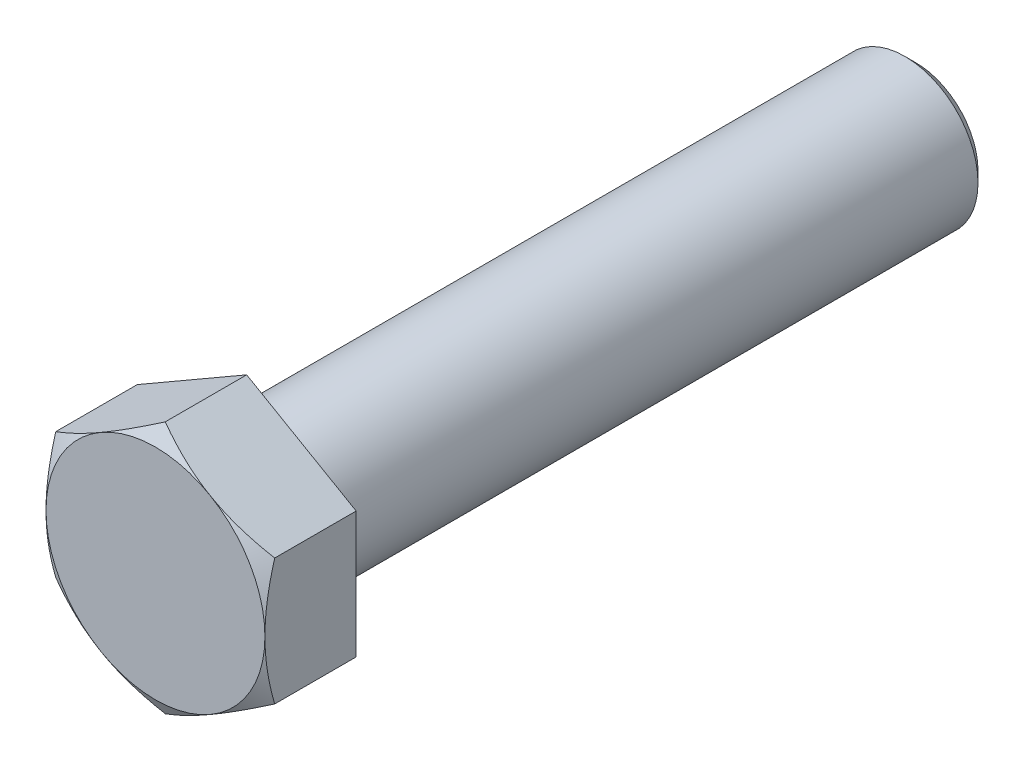
ISO-10303-21;
HEADER;
FILE_DESCRIPTION(('STEP AP214'),'2;1');
FILE_NAME('part.step','',(''),(''),'','','');
FILE_SCHEMA(('AUTOMOTIVE_DESIGN { 1 0 10303 214 1 1 1 1 }'));
ENDSEC;
DATA;
#1=APPLICATION_CONTEXT('core data for automotive mechanical design processes');
#2=APPLICATION_PROTOCOL_DEFINITION('international standard','automotive_design',2000,#1);
#3=PRODUCT_CONTEXT('',#1,'mechanical');
#4=PRODUCT('Part','Part','',(#3));
#5=PRODUCT_RELATED_PRODUCT_CATEGORY('part','',(#4));
#6=PRODUCT_DEFINITION_FORMATION('','',#4);
#7=PRODUCT_DEFINITION_CONTEXT('part definition',#1,'design');
#8=PRODUCT_DEFINITION('design','',#6,#7);
#9=PRODUCT_DEFINITION_SHAPE('','',#8);
#10=(LENGTH_UNIT() NAMED_UNIT(*) SI_UNIT(.MILLI.,.METRE.));
#11=(NAMED_UNIT(*) PLANE_ANGLE_UNIT() SI_UNIT($,.RADIAN.));
#12=(NAMED_UNIT(*) SI_UNIT($,.STERADIAN.) SOLID_ANGLE_UNIT());
#13=UNCERTAINTY_MEASURE_WITH_UNIT(LENGTH_MEASURE(1.E-05),#10,'distance_accuracy_value','');
#14=(GEOMETRIC_REPRESENTATION_CONTEXT(3) GLOBAL_UNCERTAINTY_ASSIGNED_CONTEXT((#13)) GLOBAL_UNIT_ASSIGNED_CONTEXT((#10,
#11,#12)) REPRESENTATION_CONTEXT('',''));
#15=CARTESIAN_POINT('',(0.,0.,0.));
#16=DIRECTION('',(0.,0.,1.));
#17=DIRECTION('',(1.,0.,0.));
#18=AXIS2_PLACEMENT_3D('',#15,#16,#17);
#19=CARTESIAN_POINT('',(0.,0.,7.5));
#20=DIRECTION('',(0.,0.,1.));
#21=DIRECTION('',(1.,0.,0.));
#22=AXIS2_PLACEMENT_3D('',#19,#20,#21);
#23=PLANE('',#22);
#24=CARTESIAN_POINT('',(0.,0.,7.50000000089275));
#25=DIRECTION('',(0.,0.,-1.));
#26=DIRECTION('',(-1.,0.,0.));
#27=AXIS2_PLACEMENT_3D('',#24,#25,#26);
#28=CIRCLE('',#27,9.00000000051543);
#29=CARTESIAN_POINT('',(4.49980199141646,7.79434295131304,7.50000000104154));
#30=VERTEX_POINT('',#29);
#31=CARTESIAN_POINT('',(9.00000000025772,0.,7.50000000104154));
#32=VERTEX_POINT('',#31);
#33=EDGE_CURVE('E330',#30,#32,#28,.T.);
#34=ORIENTED_EDGE('',*,*,#33,.F.);
#35=CARTESIAN_POINT('',(0.,0.,7.50000000089275));
#36=DIRECTION('',(0.,0.,-1.));
#37=DIRECTION('',(-1.,0.,0.));
#38=AXIS2_PLACEMENT_3D('',#35,#36,#37);
#39=CIRCLE('',#38,9.00000000051543);
#40=CARTESIAN_POINT('',(-4.49980199141648,7.79434295131303,7.50000000104154));
#41=VERTEX_POINT('',#40);
#42=EDGE_CURVE('E93',#41,#30,#39,.T.);
#43=ORIENTED_EDGE('',*,*,#42,.F.);
#44=CARTESIAN_POINT('',(0.,0.,7.50000000089275));
#45=DIRECTION('',(0.,0.,-1.));
#46=DIRECTION('',(-1.,0.,0.));
#47=AXIS2_PLACEMENT_3D('',#44,#45,#46);
#48=CIRCLE('',#47,9.00000000051543);
#49=CARTESIAN_POINT('',(-9.00000000025772,0.,7.50000000104155));
#50=VERTEX_POINT('',#49);
#51=EDGE_CURVE('E89',#50,#41,#48,.T.);
#52=ORIENTED_EDGE('',*,*,#51,.F.);
#53=CARTESIAN_POINT('',(0.,0.,7.50000000089275));
#54=DIRECTION('',(0.,0.,-1.));
#55=DIRECTION('',(-1.,0.,0.));
#56=AXIS2_PLACEMENT_3D('',#53,#54,#55);
#57=CIRCLE('',#56,9.00000000051543);
#58=CARTESIAN_POINT('',(-4.49980199141646,-7.79434295131305,7.50000000104154));
#59=VERTEX_POINT('',#58);
#60=EDGE_CURVE('E87',#59,#50,#57,.T.);
#61=ORIENTED_EDGE('',*,*,#60,.F.);
#62=CARTESIAN_POINT('',(0.,0.,7.50000000089275));
#63=DIRECTION('',(0.,0.,-1.));
#64=DIRECTION('',(-1.,0.,0.));
#65=AXIS2_PLACEMENT_3D('',#62,#63,#64);
#66=CIRCLE('',#65,9.00000000051543);
#67=CARTESIAN_POINT('',(4.49980199141647,-7.79434295131304,7.50000000104154));
#68=VERTEX_POINT('',#67);
#69=EDGE_CURVE('E20',#68,#59,#66,.T.);
#70=ORIENTED_EDGE('',*,*,#69,.F.);
#71=CARTESIAN_POINT('',(0.,0.,7.50000000089275));
#72=DIRECTION('',(0.,0.,-1.));
#73=DIRECTION('',(-1.,0.,0.));
#74=AXIS2_PLACEMENT_3D('',#71,#72,#73);
#75=CIRCLE('',#74,9.00000000051543);
#76=EDGE_CURVE('E104',#32,#68,#75,.T.);
#77=ORIENTED_EDGE('',*,*,#76,.F.);
#78=EDGE_LOOP('',(#34,#43,#52,#61,#70,#77));
#79=FACE_BOUND('',#78,.T.);
#80=ADVANCED_FACE('F17',(#79),#23,.T.);
#81=CARTESIAN_POINT('',(0.,0.,6.69141786445974));
#82=DIRECTION('',(0.,0.,-1.));
#83=DIRECTION('',(-1.,0.,0.));
#84=AXIS2_PLACEMENT_3D('',#81,#82,#83);
#85=CONICAL_SURFACE('',#84,10.4005053390398,1.04719755);
#86=ORIENTED_EDGE('',*,*,#69,.T.);
#87=CARTESIAN_POINT('',(-3.04325983601087E-10,-10.3921524249865,6.69624042187021));
#88=CARTESIAN_POINT('',(-0.366282650871695,-10.1806914446505,6.81835813302795));
#89=CARTESIAN_POINT('',(-0.735498461515287,-9.96753710299313,6.93023881785971));
#90=CARTESIAN_POINT('',(-1.47718445953881,-9.5393496146992,7.12753786716259));
#91=CARTESIAN_POINT('',(-1.84962878033096,-9.32433140126753,7.21308707136055));
#92=CARTESIAN_POINT('',(-2.41180986483081,-8.99977504297948,7.31812669429929));
#93=CARTESIAN_POINT('',(-2.59991363178527,-8.89117965393486,7.34927195340002));
#94=CARTESIAN_POINT('',(-2.97702159999228,-8.67346904036239,7.4031849885857));
#95=CARTESIAN_POINT('',(-3.16602577742088,-8.5643538295885,7.42595298509127));
#96=CARTESIAN_POINT('',(-3.54563361027975,-8.34520000316293,7.46271150557113));
#97=CARTESIAN_POINT('',(-3.73624053221588,-8.23515950170385,7.47665739610894));
#98=CARTESIAN_POINT('',(-4.1178291891883,-8.01486211303708,7.49532094447683));
#99=CARTESIAN_POINT('',(-4.30881099094728,-7.90460518730928,7.50003677511759));
#100=CARTESIAN_POINT('',(-4.49980199126901,-7.79434295110059,7.50000000119034));
#101=B_SPLINE_CURVE_WITH_KNOTS('',3,(#87,#88,#89,#90,#91,#92,#93,#94,#95,#96,#97,#98,#99,#100),
.UNSPECIFIED.,.F.,.F.,(4,2,2,2,2,2,4),(0.,1.32118640259763,2.63569777605002,3.29381576738512,
3.95191644123143,4.61332054383155,5.27485556522859),.UNSPECIFIED.);
#102=CARTESIAN_POINT('',(-1.18928590936815E-10,-10.3921524248736,6.69624042171544));
#103=VERTEX_POINT('',#102);
#104=EDGE_CURVE('E99',#103,#59,#101,.T.);
#105=ORIENTED_EDGE('',*,*,#104,.F.);
#106=CARTESIAN_POINT('',(4.49980199122319,-7.79434295097825,7.50000000111594));
#107=CARTESIAN_POINT('',(4.30881099093911,-7.90460518726072,7.50003677509123));
#108=CARTESIAN_POINT('',(4.11782918919385,-8.01486211301964,7.49532094447014));
#109=CARTESIAN_POINT('',(3.73624053222854,-8.23515950171078,7.47665739611652));
#110=CARTESIAN_POINT('',(3.5456336102858,-8.34520000316313,7.46271150557336));
#111=CARTESIAN_POINT('',(3.16602577742061,-8.56435382958498,7.4259529850896));
#112=CARTESIAN_POINT('',(2.97702159999227,-8.67346904036184,7.40318498858548));
#113=CARTESIAN_POINT('',(2.59991363178349,-8.89117965393645,7.34927195339998));
#114=CARTESIAN_POINT('',(2.41180986482701,-8.99977504298023,7.31812669429795));
#115=CARTESIAN_POINT('',(1.84962878032432,-9.32433140127427,7.21308707136057));
#116=CARTESIAN_POINT('',(1.47718445953471,-9.53934961472117,7.12753786717053));
#117=CARTESIAN_POINT('',(0.735498461491745,-9.96753710298703,6.93023881784436));
#118=CARTESIAN_POINT('',(0.366282650826081,-10.1806914446008,6.81835813298107));
#119=CARTESIAN_POINT('',(2.09095072674275E-10,-10.3921524248215,6.69624042174549));
#120=B_SPLINE_CURVE_WITH_KNOTS('',3,(#106,#107,#108,#109,#110,#111,#112,#113,#114,#115,#116,
#117,#118,#119),.UNSPECIFIED.,.F.,.F.,(4,2,2,2,2,2,4),(0.,0.66153502140683,1.32293912401436,
1.98103979786425,2.63915778920398,3.95366916266618,5.27485556527991),.UNSPECIFIED.);
#121=EDGE_CURVE('E102',#68,#103,#120,.T.);
#122=ORIENTED_EDGE('',*,*,#121,.F.);
#123=EDGE_LOOP('',(#86,#105,#122));
#124=FACE_BOUND('',#123,.T.);
#125=ADVANCED_FACE('F97',(#124),#85,.T.);
#126=CARTESIAN_POINT('',(0.,0.,6.69128507002485));
#127=DIRECTION('',(0.,0.,-1.));
#128=DIRECTION('',(-1.,0.,0.));
#129=AXIS2_PLACEMENT_3D('',#126,#127,#128);
#130=CONICAL_SURFACE('',#129,10.4007353457474,1.04719755);
#131=ORIENTED_EDGE('',*,*,#76,.T.);
#132=CARTESIAN_POINT('',(8.9999999998861,-5.19630485017032,6.69610841944983));
#133=CARTESIAN_POINT('',(8.63368614233858,-5.4077838465214,6.81824455309161));
#134=CARTESIAN_POINT('',(8.2644386302865,-5.62095648980817,6.93014280452131));
#135=CARTESIAN_POINT('',(7.52268861379889,-6.04918093693101,7.12747361831722));
#136=CARTESIAN_POINT('',(7.15021198431769,-6.26421780273128,7.21303705310768));
#137=CARTESIAN_POINT('',(6.5879815810445,-6.58880263356686,7.31809456198165));
#138=CARTESIAN_POINT('',(6.39986118784768,-6.69740762121114,7.34924521216105));
#139=CARTESIAN_POINT('',(6.02271974488272,-6.91513756030829,7.40316766575794));
#140=CARTESIAN_POINT('',(5.83369871895668,-7.02426249799673,7.42593968974489));
#141=CARTESIAN_POINT('',(5.45405681546372,-7.24343599395859,7.46270476497939));
#142=CARTESIAN_POINT('',(5.26343267012592,-7.35348643876973,7.47665316953512));
#143=CARTESIAN_POINT('',(4.88180945899705,-7.57380377611733,7.49532009524033));
#144=CARTESIAN_POINT('',(4.69081032644166,-7.68407070719793,7.50003678822402));
#145=CARTESIAN_POINT('',(4.49980199130622,-7.79434295107911,7.50000000119034));
#146=B_SPLINE_CURVE_WITH_KNOTS('',3,(#132,#133,#134,#135,#136,#137,#138,#139,#140,#141,#142,
#143,#144,#145),.UNSPECIFIED.,.F.,.F.,(4,2,2,2,2,2,4),(0.,1.32130577739059,2.63593508148456,
3.294112343909,3.95227227840958,4.61373635001325,5.27533139881138),.UNSPECIFIED.);
#147=CARTESIAN_POINT('',(8.99999999988102,-5.19630484995321,6.696108419295));
#148=VERTEX_POINT('',#147);
#149=EDGE_CURVE('E113',#148,#68,#146,.T.);
#150=ORIENTED_EDGE('',*,*,#149,.F.);
#151=CARTESIAN_POINT('',(8.99999999987114,0.,7.50000000111594));
#152=CARTESIAN_POINT('',(8.99999999995373,-0.220554192577918,7.50003678819766));
#153=CARTESIAN_POINT('',(8.9999999999876,-0.441097759086821,7.49532009523364));
#154=CARTESIAN_POINT('',(9.0000000000124,-0.881751823420233,7.4766531695427));
#155=CARTESIAN_POINT('',(9.00000000000332,-1.10186239833642,7.46270476498162));
#156=CARTESIAN_POINT('',(8.9999999999967,-1.5402286792284,7.42593968974322));
#157=CARTESIAN_POINT('',(8.99999999999909,-1.75848815844567,7.40316766575773));
#158=CARTESIAN_POINT('',(9.00000000000091,-2.19396719856494,7.34924521216101));
#159=CARTESIAN_POINT('',(9.00000000000033,-2.41118673193686,7.3180945619803));
#160=CARTESIAN_POINT('',(8.99999999999934,-3.06038495958416,7.21303705310769));
#161=CARTESIAN_POINT('',(8.99999999999967,-3.49047761607522,7.12747361832516));
#162=CARTESIAN_POINT('',(9.00000000000033,-4.34696419745162,6.93014280450596));
#163=CARTESIAN_POINT('',(9.00000000000067,-4.77332824495118,6.81824455304471));
#164=CARTESIAN_POINT('',(9.,-5.19630484964299,6.69610841932507));
#165=B_SPLINE_CURVE_WITH_KNOTS('',3,(#151,#152,#153,#154,#155,#156,#157,#158,#159,#160,#161,
#162,#163,#164),.UNSPECIFIED.,.F.,.F.,(4,2,2,2,2,2,4),(0.,0.661595048807914,1.32305912041901,
1.98121905492316,2.63939631735222,3.95402562145601,5.27533139886271),.UNSPECIFIED.);
#166=EDGE_CURVE('E144',#32,#148,#165,.T.);
#167=ORIENTED_EDGE('',*,*,#166,.F.);
#168=EDGE_LOOP('',(#131,#150,#167));
#169=FACE_BOUND('',#168,.T.);
#170=ADVANCED_FACE('F135',(#169),#130,.T.);
#171=CARTESIAN_POINT('',(0.,0.,6.69128507002485));
#172=DIRECTION('',(0.,0.,-1.));
#173=DIRECTION('',(-1.,0.,0.));
#174=AXIS2_PLACEMENT_3D('',#171,#172,#173);
#175=CONICAL_SURFACE('',#174,10.4007353457474,1.04719755);
#176=CARTESIAN_POINT('',(4.49980199122319,7.79434295097825,7.50000000111594));
#177=CARTESIAN_POINT('',(4.6908103264037,7.68407070716656,7.50003678819766));
#178=CARTESIAN_POINT('',(4.88180945897918,7.5738037761134,7.49532009523364));
#179=CARTESIAN_POINT('',(5.2634326701256,7.35348643878415,7.47665316954271));
#180=CARTESIAN_POINT('',(5.45405681546087,7.24343599396393,7.46270476498162));
#181=CARTESIAN_POINT('',(5.83369871895377,7.02426249799474,7.42593968974322));
#182=CARTESIAN_POINT('',(6.02271974488227,6.915137560308,7.40316766575773));
#183=CARTESIAN_POINT('',(6.39986118784996,6.69740762121039,7.34924521216101));
#184=CARTESIAN_POINT('',(6.58798158104705,6.58880263356394,7.3180945619803));
#185=CARTESIAN_POINT('',(7.15021198432686,6.26421780272889,7.2130370531077));
#186=CARTESIAN_POINT('',(7.52268861381999,6.04918093693843,7.12747361832516));
#187=CARTESIAN_POINT('',(8.264438630293,5.62095648978472,6.93014280450596));
#188=CARTESIAN_POINT('',(8.63368614231832,5.407783846457,6.81824455304471));
#189=CARTESIAN_POINT('',(8.99999999979083,5.19630485000529,6.69610841932506));
#190=B_SPLINE_CURVE_WITH_KNOTS('',3,(#176,#177,#178,#179,#180,#181,#182,#183,#184,#185,#186,
#187,#188,#189),.UNSPECIFIED.,.F.,.F.,(4,2,2,2,2,2,4),(0.,0.661595048807915,1.32305912041901,
1.98121905492316,2.63939631735222,3.95402562145602,5.27533139886272),.UNSPECIFIED.);
#191=CARTESIAN_POINT('',(9.,5.19630484974714,6.696108419295));
#192=VERTEX_POINT('',#191);
#193=EDGE_CURVE('E173',#30,#192,#190,.T.);
#194=ORIENTED_EDGE('',*,*,#193,.F.);
#195=ORIENTED_EDGE('',*,*,#33,.T.);
#196=CARTESIAN_POINT('',(9.00000000019057,5.196304849643,6.69610841944983));
#197=CARTESIAN_POINT('',(9.00000000006657,4.77332824493653,6.8182445530916));
#198=CARTESIAN_POINT('',(9.0000000000174,4.34696419743426,6.93014280452131));
#199=CARTESIAN_POINT('',(8.99999999998269,3.49047761606066,7.12747361831722));
#200=CARTESIAN_POINT('',(8.99999999999683,3.06038495957502,7.21303705310767));
#201=CARTESIAN_POINT('',(9.00000000000159,2.41118673193319,7.31809456198165));
#202=CARTESIAN_POINT('',(9.00000000000043,2.19396719856259,7.34924521216105));
#203=CARTESIAN_POINT('',(8.99999999999957,1.75848815844592,7.40316766575794));
#204=CARTESIAN_POINT('',(8.99999999999988,1.54022867922991,7.42593968974489));
#205=CARTESIAN_POINT('',(9.00000000000012,1.10186239834155,7.46270476497938));
#206=CARTESIAN_POINT('',(9.00000000000006,0.881751823427716,7.47665316953512));
#207=CARTESIAN_POINT('',(8.99999999999994,0.441097759100332,7.49532009524033));
#208=CARTESIAN_POINT('',(8.99999999999988,0.220554192595102,7.50003678822402));
#209=CARTESIAN_POINT('',(9.,2.14766825265456E-11,7.50000000119034));
#210=B_SPLINE_CURVE_WITH_KNOTS('',3,(#196,#197,#198,#199,#200,#201,#202,#203,#204,#205,#206,
#207,#208,#209),.UNSPECIFIED.,.F.,.F.,(4,2,2,2,2,2,4),(0.,1.32130577739059,2.63593508148457,
3.294112343909,3.95227227840958,4.61373635001326,5.27533139881138),.UNSPECIFIED.);
#211=EDGE_CURVE('E167',#192,#32,#210,.T.);
#212=ORIENTED_EDGE('',*,*,#211,.F.);
#213=EDGE_LOOP('',(#194,#195,#212));
#214=FACE_BOUND('',#213,.T.);
#215=ADVANCED_FACE('F179',(#214),#175,.T.);
#216=CARTESIAN_POINT('',(0.,0.,6.69141786445974));
#217=DIRECTION('',(0.,0.,-1.));
#218=DIRECTION('',(-1.,0.,0.));
#219=AXIS2_PLACEMENT_3D('',#216,#217,#218);
#220=CONICAL_SURFACE('',#219,10.4005053390398,1.04719755);
#221=CARTESIAN_POINT('',(-4.4998019912232,7.79434295097825,7.50000000111594));
#222=CARTESIAN_POINT('',(-4.30881099093911,7.90460518726072,7.50003677509123));
#223=CARTESIAN_POINT('',(-4.11782918919386,8.01486211301964,7.49532094447014));
#224=CARTESIAN_POINT('',(-3.73624053222855,8.23515950171079,7.47665739611652));
#225=CARTESIAN_POINT('',(-3.54563361028581,8.34520000316313,7.46271150557336));
#226=CARTESIAN_POINT('',(-3.16602577742062,8.56435382958499,7.4259529850896));
#227=CARTESIAN_POINT('',(-2.97702159999227,8.67346904036185,7.40318498858548));
#228=CARTESIAN_POINT('',(-2.59991363178349,8.89117965393645,7.34927195339998));
#229=CARTESIAN_POINT('',(-2.41180986482702,8.99977504298023,7.31812669429795));
#230=CARTESIAN_POINT('',(-1.84962878032432,9.32433140127427,7.21308707136057));
#231=CARTESIAN_POINT('',(-1.47718445953471,9.53934961472117,7.12753786717053));
#232=CARTESIAN_POINT('',(-0.735498461491748,9.96753710298703,6.93023881784436));
#233=CARTESIAN_POINT('',(-0.366282650826083,10.1806914446008,6.81835813298107));
#234=CARTESIAN_POINT('',(-2.09097630103049E-10,10.3921524248216,6.69624042174549));
#235=B_SPLINE_CURVE_WITH_KNOTS('',3,(#221,#222,#223,#224,#225,#226,#227,#228,#229,#230,#231,
#232,#233,#234),.UNSPECIFIED.,.F.,.F.,(4,2,2,2,2,2,4),(0.,0.66153502140683,1.32293912401437,
1.98103979786425,2.63915778920398,3.95366916266618,5.27485556527992),.UNSPECIFIED.);
#236=CARTESIAN_POINT('',(1.18924292882693E-10,10.3921524248736,6.69624042171544));
#237=VERTEX_POINT('',#236);
#238=EDGE_CURVE('E196',#41,#237,#235,.T.);
#239=ORIENTED_EDGE('',*,*,#238,.F.);
#240=ORIENTED_EDGE('',*,*,#42,.T.);
#241=CARTESIAN_POINT('',(3.04323982167941E-10,10.3921524249865,6.69624042187021));
#242=CARTESIAN_POINT('',(0.366282650871691,10.1806914446505,6.81835813302795));
#243=CARTESIAN_POINT('',(0.735498461515285,9.96753710299313,6.93023881785971));
#244=CARTESIAN_POINT('',(1.47718445953881,9.5393496146992,7.12753786716259));
#245=CARTESIAN_POINT('',(1.84962878033096,9.32433140126753,7.21308707136055));
#246=CARTESIAN_POINT('',(2.41180986483082,8.99977504297948,7.31812669429929));
#247=CARTESIAN_POINT('',(2.59991363178527,8.89117965393486,7.34927195340002));
#248=CARTESIAN_POINT('',(2.97702159999228,8.67346904036239,7.4031849885857));
#249=CARTESIAN_POINT('',(3.16602577742088,8.5643538295885,7.42595298509127));
#250=CARTESIAN_POINT('',(3.54563361027975,8.34520000316293,7.46271150557113));
#251=CARTESIAN_POINT('',(3.73624053221588,8.23515950170385,7.47665739610894));
#252=CARTESIAN_POINT('',(4.11782918918831,8.01486211303707,7.49532094447683));
#253=CARTESIAN_POINT('',(4.30881099094729,7.90460518730927,7.50003677511759));
#254=CARTESIAN_POINT('',(4.49980199126901,7.79434295110059,7.50000000119034));
#255=B_SPLINE_CURVE_WITH_KNOTS('',3,(#241,#242,#243,#244,#245,#246,#247,#248,#249,#250,#251,
#252,#253,#254),.UNSPECIFIED.,.F.,.F.,(4,2,2,2,2,2,4),(0.,1.32118640259764,2.63569777605002,
3.29381576738513,3.95191644123144,4.61332054383155,5.2748555652286),.UNSPECIFIED.);
#256=EDGE_CURVE('E191',#237,#30,#255,.T.);
#257=ORIENTED_EDGE('',*,*,#256,.F.);
#258=EDGE_LOOP('',(#239,#240,#257));
#259=FACE_BOUND('',#258,.T.);
#260=ADVANCED_FACE('F183',(#259),#220,.T.);
#261=CARTESIAN_POINT('',(0.,0.,6.69128507002485));
#262=DIRECTION('',(0.,0.,-1.));
#263=DIRECTION('',(-1.,0.,0.));
#264=AXIS2_PLACEMENT_3D('',#261,#262,#263);
#265=CONICAL_SURFACE('',#264,10.4007353457474,1.04719755);
#266=ORIENTED_EDGE('',*,*,#60,.T.);
#267=CARTESIAN_POINT('',(-9.00000000019056,-5.19630484964301,6.69610841944983));
#268=CARTESIAN_POINT('',(-9.00000000006656,-4.77332824493654,6.8182445530916));
#269=CARTESIAN_POINT('',(-9.0000000000174,-4.34696419743427,6.93014280452131));
#270=CARTESIAN_POINT('',(-8.99999999998269,-3.49047761606067,7.12747361831722));
#271=CARTESIAN_POINT('',(-8.99999999999683,-3.06038495957502,7.21303705310768));
#272=CARTESIAN_POINT('',(-9.00000000000159,-2.41118673193319,7.31809456198165));
#273=CARTESIAN_POINT('',(-9.00000000000043,-2.1939671985626,7.34924521216106));
#274=CARTESIAN_POINT('',(-8.99999999999957,-1.75848815844592,7.40316766575794));
#275=CARTESIAN_POINT('',(-8.99999999999987,-1.54022867922991,7.42593968974489));
#276=CARTESIAN_POINT('',(-9.00000000000012,-1.10186239834155,7.46270476497939));
#277=CARTESIAN_POINT('',(-9.00000000000006,-0.881751823427717,7.47665316953512));
#278=CARTESIAN_POINT('',(-8.99999999999994,-0.441097759100333,7.49532009524033));
#279=CARTESIAN_POINT('',(-8.99999999999987,-0.220554192595103,7.50003678822402));
#280=CARTESIAN_POINT('',(-9.,-2.14771976068342E-11,7.50000000119034));
#281=B_SPLINE_CURVE_WITH_KNOTS('',3,(#267,#268,#269,#270,#271,#272,#273,#274,#275,#276,#277,
#278,#279,#280),.UNSPECIFIED.,.F.,.F.,(4,2,2,2,2,2,4),(0.,1.32130577739059,2.63593508148457,
3.29411234390901,3.95227227840959,4.61373635001326,5.27533139881139),.UNSPECIFIED.);
#282=CARTESIAN_POINT('',(-8.99999999988101,-5.19630484981584,6.69610841933466));
#283=VERTEX_POINT('',#282);
#284=EDGE_CURVE('E109',#283,#50,#281,.T.);
#285=ORIENTED_EDGE('',*,*,#284,.F.);
#286=CARTESIAN_POINT('',(-4.49980199122318,-7.79434295097826,7.50000000111594));
#287=CARTESIAN_POINT('',(-4.6908103264037,-7.68407070716656,7.50003678819766));
#288=CARTESIAN_POINT('',(-4.88180945897917,-7.57380377611341,7.49532009523364));
#289=CARTESIAN_POINT('',(-5.26343267012559,-7.35348643878416,7.47665316954271));
#290=CARTESIAN_POINT('',(-5.45405681546087,-7.24343599396393,7.46270476498162));
#291=CARTESIAN_POINT('',(-5.83369871895377,-7.02426249799474,7.42593968974322));
#292=CARTESIAN_POINT('',(-6.02271974488226,-6.91513756030801,7.40316766575773));
#293=CARTESIAN_POINT('',(-6.39986118784995,-6.69740762121039,7.34924521216101));
#294=CARTESIAN_POINT('',(-6.58798158104705,-6.58880263356394,7.31809456198031));
#295=CARTESIAN_POINT('',(-7.15021198432686,-6.26421780272889,7.2130370531077));
#296=CARTESIAN_POINT('',(-7.52268861381998,-6.04918093693844,7.12747361832516));
#297=CARTESIAN_POINT('',(-8.26443863029299,-5.62095648978472,6.93014280450596));
#298=CARTESIAN_POINT('',(-8.63368614231832,-5.40778384645701,6.81824455304471));
#299=CARTESIAN_POINT('',(-8.99999999979082,-5.19630485000529,6.69610841932507));
#300=B_SPLINE_CURVE_WITH_KNOTS('',3,(#286,#287,#288,#289,#290,#291,#292,#293,#294,#295,#296,
#297,#298,#299),.UNSPECIFIED.,.F.,.F.,(4,2,2,2,2,2,4),(0.,0.661595048807915,1.32305912041901,
1.98121905492316,2.63939631735222,3.95402562145602,5.27533139886272),.UNSPECIFIED.);
#301=EDGE_CURVE('E106',#59,#283,#300,.T.);
#302=ORIENTED_EDGE('',*,*,#301,.F.);
#303=EDGE_LOOP('',(#266,#285,#302));
#304=FACE_BOUND('',#303,.T.);
#305=ADVANCED_FACE('F107',(#304),#265,.T.);
#306=CARTESIAN_POINT('',(0.,0.,6.69128507002485));
#307=DIRECTION('',(0.,0.,-1.));
#308=DIRECTION('',(-1.,0.,0.));
#309=AXIS2_PLACEMENT_3D('',#306,#307,#308);
#310=CONICAL_SURFACE('',#309,10.4007353457474,1.04719755);
#311=ORIENTED_EDGE('',*,*,#51,.T.);
#312=CARTESIAN_POINT('',(-8.9999999998861,5.19630485017032,6.69610841944983));
#313=CARTESIAN_POINT('',(-8.63368614233858,5.4077838465214,6.81824455309161));
#314=CARTESIAN_POINT('',(-8.2644386302865,5.62095648980817,6.93014280452131));
#315=CARTESIAN_POINT('',(-7.52268861379889,6.04918093693101,7.12747361831722));
#316=CARTESIAN_POINT('',(-7.15021198431769,6.26421780273128,7.21303705310768));
#317=CARTESIAN_POINT('',(-6.5879815810445,6.58880263356686,7.31809456198165));
#318=CARTESIAN_POINT('',(-6.39986118784769,6.69740762121114,7.34924521216105));
#319=CARTESIAN_POINT('',(-6.02271974488273,6.9151375603083,7.40316766575794));
#320=CARTESIAN_POINT('',(-5.83369871895668,7.02426249799673,7.42593968974489));
#321=CARTESIAN_POINT('',(-5.45405681546373,7.24343599395859,7.46270476497938));
#322=CARTESIAN_POINT('',(-5.26343267012593,7.35348643876973,7.47665316953512));
#323=CARTESIAN_POINT('',(-4.88180945899706,7.57380377611733,7.49532009524033));
#324=CARTESIAN_POINT('',(-4.69081032644167,7.68407070719793,7.50003678822401));
#325=CARTESIAN_POINT('',(-4.49980199130623,7.79434295107911,7.50000000119034));
#326=B_SPLINE_CURVE_WITH_KNOTS('',3,(#312,#313,#314,#315,#316,#317,#318,#319,#320,#321,#322,
#323,#324,#325),.UNSPECIFIED.,.F.,.F.,(4,2,2,2,2,2,4),(0.,1.32130577739059,2.63593508148456,
3.29411234390899,3.95227227840957,4.61373635001324,5.27533139881137),.UNSPECIFIED.);
#327=CARTESIAN_POINT('',(-8.99999999988101,5.19630484995321,6.696108419295));
#328=VERTEX_POINT('',#327);
#329=EDGE_CURVE('E203',#328,#41,#326,.T.);
#330=ORIENTED_EDGE('',*,*,#329,.F.);
#331=CARTESIAN_POINT('',(-8.99999999987114,0.,7.50000000111594));
#332=CARTESIAN_POINT('',(-8.99999999995373,0.220554192577917,7.50003678819766));
#333=CARTESIAN_POINT('',(-8.9999999999876,0.44109775908682,7.49532009523364));
#334=CARTESIAN_POINT('',(-9.00000000001239,0.881751823420232,7.47665316954271));
#335=CARTESIAN_POINT('',(-9.00000000000332,1.10186239833642,7.46270476498162));
#336=CARTESIAN_POINT('',(-8.99999999999669,1.5402286792284,7.42593968974322));
#337=CARTESIAN_POINT('',(-8.99999999999909,1.75848815844567,7.40316766575773));
#338=CARTESIAN_POINT('',(-9.00000000000091,2.19396719856494,7.34924521216101));
#339=CARTESIAN_POINT('',(-9.00000000000033,2.41118673193686,7.31809456198031));
#340=CARTESIAN_POINT('',(-8.99999999999934,3.06038495958416,7.2130370531077));
#341=CARTESIAN_POINT('',(-8.99999999999967,3.49047761607522,7.12747361832516));
#342=CARTESIAN_POINT('',(-9.00000000000033,4.34696419745161,6.93014280450596));
#343=CARTESIAN_POINT('',(-9.00000000000066,4.77332824495118,6.81824455304471));
#344=CARTESIAN_POINT('',(-9.,5.19630484964299,6.69610841932507));
#345=B_SPLINE_CURVE_WITH_KNOTS('',3,(#331,#332,#333,#334,#335,#336,#337,#338,#339,#340,#341,
#342,#343,#344),.UNSPECIFIED.,.F.,.F.,(4,2,2,2,2,2,4),(0.,0.661595048807914,1.32305912041901,
1.98121905492316,2.63939631735222,3.95402562145601,5.27533139886271),.UNSPECIFIED.);
#346=EDGE_CURVE('E222',#50,#328,#345,.T.);
#347=ORIENTED_EDGE('',*,*,#346,.F.);
#348=EDGE_LOOP('',(#311,#330,#347));
#349=FACE_BOUND('',#348,.T.);
#350=ADVANCED_FACE('F408',(#349),#310,.T.);
#351=CARTESIAN_POINT('',(0.,-10.3921524249423,0.));
#352=DIRECTION('',(-0.499977999031957,-0.86603810567665,0.));
#353=DIRECTION('',(0.86603810567665,-0.499977999031957,0.));
#354=AXIS2_PLACEMENT_3D('',#351,#352,#353);
#355=PLANE('',#354);
#356=DIRECTION('',(0.86603810567665,-0.499977999031957,0.));
#357=VECTOR('',#356,1.);
#358=CARTESIAN_POINT('',(-9.,-5.19630484988453,0.));
#359=LINE('',#358,#357);
#360=CARTESIAN_POINT('',(-9.,-5.19630484988453,0.));
#361=VERTEX_POINT('',#360);
#362=CARTESIAN_POINT('',(0.,-10.3921524249423,0.));
#363=VERTEX_POINT('',#362);
#364=EDGE_CURVE('E259',#361,#363,#359,.T.);
#365=ORIENTED_EDGE('',*,*,#364,.T.);
#366=DIRECTION('',(0.,0.,1.));
#367=VECTOR('',#366,1.);
#368=CARTESIAN_POINT('',(0.,-10.3921524249423,0.));
#369=LINE('',#368,#367);
#370=EDGE_CURVE('E117',#103,#363,#369,.F.);
#371=ORIENTED_EDGE('',*,*,#370,.F.);
#372=ORIENTED_EDGE('',*,*,#104,.T.);
#373=ORIENTED_EDGE('',*,*,#301,.T.);
#374=DIRECTION('',(0.,0.,1.));
#375=VECTOR('',#374,1.);
#376=CARTESIAN_POINT('',(-9.,-5.19630484988453,0.));
#377=LINE('',#376,#375);
#378=EDGE_CURVE('E262',#361,#283,#377,.T.);
#379=ORIENTED_EDGE('',*,*,#378,.F.);
#380=EDGE_LOOP('',(#365,#371,#372,#373,#379));
#381=FACE_BOUND('',#380,.T.);
#382=ADVANCED_FACE('F115',(#381),#355,.T.);
#383=CARTESIAN_POINT('',(9.,-5.19630484988452,0.));
#384=DIRECTION('',(0.499977999031958,-0.86603810567665,0.));
#385=DIRECTION('',(0.86603810567665,0.499977999031958,0.));
#386=AXIS2_PLACEMENT_3D('',#383,#384,#385);
#387=PLANE('',#386);
#388=DIRECTION('',(0.86603810567665,0.499977999031958,0.));
#389=VECTOR('',#388,1.);
#390=CARTESIAN_POINT('',(0.,-10.3921524249423,0.));
#391=LINE('',#390,#389);
#392=CARTESIAN_POINT('',(9.,-5.19630484988452,0.));
#393=VERTEX_POINT('',#392);
#394=EDGE_CURVE('E261',#363,#393,#391,.T.);
#395=ORIENTED_EDGE('',*,*,#394,.T.);
#396=DIRECTION('',(0.,0.,-1.));
#397=VECTOR('',#396,1.);
#398=CARTESIAN_POINT('',(9.,-5.19630484988452,0.));
#399=LINE('',#398,#397);
#400=EDGE_CURVE('E174',#148,#393,#399,.T.);
#401=ORIENTED_EDGE('',*,*,#400,.F.);
#402=ORIENTED_EDGE('',*,*,#149,.T.);
#403=ORIENTED_EDGE('',*,*,#121,.T.);
#404=ORIENTED_EDGE('',*,*,#370,.T.);
#405=EDGE_LOOP('',(#395,#401,#402,#403,#404));
#406=FACE_BOUND('',#405,.T.);
#407=ADVANCED_FACE('F153',(#406),#387,.T.);
#408=CARTESIAN_POINT('',(9.,5.19630484988453,0.));
#409=DIRECTION('',(1.,0.,0.));
#410=DIRECTION('',(0.,0.,-1.));
#411=AXIS2_PLACEMENT_3D('',#408,#409,#410);
#412=PLANE('',#411);
#413=DIRECTION('',(0.,0.,1.));
#414=VECTOR('',#413,1.);
#415=CARTESIAN_POINT('',(9.,5.19630484988453,0.));
#416=LINE('',#415,#414);
#417=CARTESIAN_POINT('',(9.,5.19630484988453,0.));
#418=VERTEX_POINT('',#417);
#419=EDGE_CURVE('E241',#192,#418,#416,.F.);
#420=ORIENTED_EDGE('',*,*,#419,.F.);
#421=ORIENTED_EDGE('',*,*,#211,.T.);
#422=ORIENTED_EDGE('',*,*,#166,.T.);
#423=ORIENTED_EDGE('',*,*,#400,.T.);
#424=DIRECTION('',(0.,1.,0.));
#425=VECTOR('',#424,1.);
#426=CARTESIAN_POINT('',(9.,0.,0.));
#427=LINE('',#426,#425);
#428=EDGE_CURVE('E270',#393,#418,#427,.T.);
#429=ORIENTED_EDGE('',*,*,#428,.T.);
#430=EDGE_LOOP('',(#420,#421,#422,#423,#429));
#431=FACE_BOUND('',#430,.T.);
#432=ADVANCED_FACE('F156',(#431),#412,.T.);
#433=CARTESIAN_POINT('',(0.,10.3921524249423,0.));
#434=DIRECTION('',(0.499977999031957,0.86603810567665,0.));
#435=DIRECTION('',(-0.86603810567665,0.499977999031957,0.));
#436=AXIS2_PLACEMENT_3D('',#433,#434,#435);
#437=PLANE('',#436);
#438=DIRECTION('',(0.,0.,1.));
#439=VECTOR('',#438,1.);
#440=CARTESIAN_POINT('',(0.,10.3921524249423,0.));
#441=LINE('',#440,#439);
#442=CARTESIAN_POINT('',(0.,10.3921524249423,0.));
#443=VERTEX_POINT('',#442);
#444=EDGE_CURVE('E202',#237,#443,#441,.F.);
#445=ORIENTED_EDGE('',*,*,#444,.F.);
#446=ORIENTED_EDGE('',*,*,#256,.T.);
#447=ORIENTED_EDGE('',*,*,#193,.T.);
#448=ORIENTED_EDGE('',*,*,#419,.T.);
#449=DIRECTION('',(-0.86603810567665,0.499977999031957,0.));
#450=VECTOR('',#449,1.);
#451=CARTESIAN_POINT('',(9.,5.19630484988453,0.));
#452=LINE('',#451,#450);
#453=EDGE_CURVE('E266',#418,#443,#452,.T.);
#454=ORIENTED_EDGE('',*,*,#453,.T.);
#455=EDGE_LOOP('',(#445,#446,#447,#448,#454));
#456=FACE_BOUND('',#455,.T.);
#457=ADVANCED_FACE('F162',(#456),#437,.T.);
#458=CARTESIAN_POINT('',(-9.,5.19630484988452,0.));
#459=DIRECTION('',(-0.499977999031958,0.866038105676649,0.));
#460=DIRECTION('',(-0.866038105676649,-0.499977999031958,0.));
#461=AXIS2_PLACEMENT_3D('',#458,#459,#460);
#462=PLANE('',#461);
#463=DIRECTION('',(0.,0.,1.));
#464=VECTOR('',#463,1.);
#465=CARTESIAN_POINT('',(-9.,5.19630484988452,0.));
#466=LINE('',#465,#464);
#467=CARTESIAN_POINT('',(-9.,5.19630484988452,0.));
#468=VERTEX_POINT('',#467);
#469=EDGE_CURVE('E231',#328,#468,#466,.F.);
#470=ORIENTED_EDGE('',*,*,#469,.F.);
#471=ORIENTED_EDGE('',*,*,#329,.T.);
#472=ORIENTED_EDGE('',*,*,#238,.T.);
#473=ORIENTED_EDGE('',*,*,#444,.T.);
#474=DIRECTION('',(-0.866038105676649,-0.499977999031958,0.));
#475=VECTOR('',#474,1.);
#476=CARTESIAN_POINT('',(0.,10.3921524249423,0.));
#477=LINE('',#476,#475);
#478=EDGE_CURVE('E35',#443,#468,#477,.T.);
#479=ORIENTED_EDGE('',*,*,#478,.T.);
#480=EDGE_LOOP('',(#470,#471,#472,#473,#479));
#481=FACE_BOUND('',#480,.T.);
#482=ADVANCED_FACE('F208',(#481),#462,.T.);
#483=CARTESIAN_POINT('',(-9.,-5.19630484988453,0.));
#484=DIRECTION('',(-1.,0.,0.));
#485=DIRECTION('',(0.,0.,1.));
#486=AXIS2_PLACEMENT_3D('',#483,#484,#485);
#487=PLANE('',#486);
#488=DIRECTION('',(0.,1.,0.));
#489=VECTOR('',#488,1.);
#490=CARTESIAN_POINT('',(-9.,0.,0.));
#491=LINE('',#490,#489);
#492=EDGE_CURVE('E253',#468,#361,#491,.F.);
#493=ORIENTED_EDGE('',*,*,#492,.T.);
#494=ORIENTED_EDGE('',*,*,#378,.T.);
#495=ORIENTED_EDGE('',*,*,#284,.T.);
#496=ORIENTED_EDGE('',*,*,#346,.T.);
#497=ORIENTED_EDGE('',*,*,#469,.T.);
#498=EDGE_LOOP('',(#493,#494,#495,#496,#497));
#499=FACE_BOUND('',#498,.T.);
#500=ADVANCED_FACE('F212',(#499),#487,.T.);
#501=CARTESIAN_POINT('',(0.,-3.,-55.));
#502=DIRECTION('',(0.,0.,-1.));
#503=DIRECTION('',(-1.,0.,0.));
#504=AXIS2_PLACEMENT_3D('',#501,#502,#503);
#505=PLANE('',#504);
#506=CARTESIAN_POINT('',(0.,0.,-55.0000000004047));
#507=DIRECTION('',(0.,0.,1.));
#508=DIRECTION('',(1.,0.,0.));
#509=AXIS2_PLACEMENT_3D('',#506,#507,#508);
#510=CIRCLE('',#509,5.12500000036198);
#511=CARTESIAN_POINT('',(5.12500000036198,0.,-55.0000000004047));
#512=VERTEX_POINT('',#511);
#513=EDGE_CURVE('E256',#512,#512,#510,.T.);
#514=ORIENTED_EDGE('',*,*,#513,.F.);
#515=EDGE_LOOP('',(#514));
#516=FACE_BOUND('',#515,.T.);
#517=ADVANCED_FACE('F217',(#516),#505,.T.);
#518=CARTESIAN_POINT('',(0.,0.,0.));
#519=DIRECTION('',(0.,0.,1.));
#520=DIRECTION('',(1.,0.,0.));
#521=AXIS2_PLACEMENT_3D('',#518,#519,#520);
#522=PLANE('',#521);
#523=CARTESIAN_POINT('',(0.,0.,0.));
#524=DIRECTION('',(0.,0.,-1.));
#525=DIRECTION('',(0.,-1.,0.));
#526=AXIS2_PLACEMENT_3D('',#523,#524,#525);
#527=CIRCLE('',#526,6.60000000000001);
#528=CARTESIAN_POINT('',(0.,-6.60000000000001,0.));
#529=VERTEX_POINT('',#528);
#530=EDGE_CURVE('E279',#529,#529,#527,.F.);
#531=ORIENTED_EDGE('',*,*,#530,.T.);
#532=EDGE_LOOP('',(#531));
#533=FACE_BOUND('',#532,.T.);
#534=ORIENTED_EDGE('',*,*,#478,.F.);
#535=ORIENTED_EDGE('',*,*,#453,.F.);
#536=ORIENTED_EDGE('',*,*,#428,.F.);
#537=ORIENTED_EDGE('',*,*,#394,.F.);
#538=ORIENTED_EDGE('',*,*,#364,.F.);
#539=ORIENTED_EDGE('',*,*,#492,.F.);
#540=EDGE_LOOP('',(#534,#535,#536,#537,#538,#539));
#541=FACE_BOUND('',#540,.T.);
#542=ADVANCED_FACE('F321',(#533,#541),#522,.F.);
#543=CARTESIAN_POINT('',(0.,0.,-54.124999999658));
#544=DIRECTION('',(0.,0.,1.));
#545=DIRECTION('',(1.,0.,0.));
#546=AXIS2_PLACEMENT_3D('',#543,#544,#545);
#547=CONICAL_SURFACE('',#546,5.99999999951706,0.785398162487954);
#548=ORIENTED_EDGE('',*,*,#513,.T.);
#549=EDGE_LOOP('',(#548));
#550=FACE_BOUND('',#549,.T.);
#551=CARTESIAN_POINT('',(0.,0.,-54.125));
#552=DIRECTION('',(0.,0.,-1.));
#553=DIRECTION('',(-1.,0.,0.));
#554=AXIS2_PLACEMENT_3D('',#551,#552,#553);
#555=CIRCLE('',#554,6.00000000000001);
#556=CARTESIAN_POINT('',(-6.00000000000001,0.,-54.125));
#557=VERTEX_POINT('',#556);
#558=EDGE_CURVE('E26',#557,#557,#555,.F.);
#559=ORIENTED_EDGE('',*,*,#558,.F.);
#560=EDGE_LOOP('',(#559));
#561=FACE_BOUND('',#560,.T.);
#562=ADVANCED_FACE('F304',(#550,#561),#547,.T.);
#563=CARTESIAN_POINT('',(0.,0.,-0.600000000000001));
#564=DIRECTION('',(0.,0.,1.));
#565=DIRECTION('',(1.,0.,0.));
#566=AXIS2_PLACEMENT_3D('',#563,#564,#565);
#567=TOROIDAL_SURFACE('',#566,6.60000000000001,0.6);
#568=ORIENTED_EDGE('',*,*,#530,.F.);
#569=EDGE_LOOP('',(#568));
#570=FACE_BOUND('',#569,.T.);
#571=CARTESIAN_POINT('',(0.,0.,-0.6));
#572=DIRECTION('',(0.,0.,-1.));
#573=DIRECTION('',(-1.,0.,0.));
#574=AXIS2_PLACEMENT_3D('',#571,#572,#573);
#575=CIRCLE('',#574,6.00000000000001);
#576=CARTESIAN_POINT('',(-6.00000000000001,0.,-0.6));
#577=VERTEX_POINT('',#576);
#578=EDGE_CURVE('E11',#577,#577,#575,.T.);
#579=ORIENTED_EDGE('',*,*,#578,.F.);
#580=EDGE_LOOP('',(#579));
#581=FACE_BOUND('',#580,.T.);
#582=ADVANCED_FACE('F298',(#570,#581),#567,.F.);
#583=CARTESIAN_POINT('',(0.,0.,-27.5));
#584=DIRECTION('',(0.,0.,-1.));
#585=DIRECTION('',(-1.,0.,0.));
#586=AXIS2_PLACEMENT_3D('',#583,#584,#585);
#587=CYLINDRICAL_SURFACE('',#586,6.00000000000001);
#588=ORIENTED_EDGE('',*,*,#578,.T.);
#589=EDGE_LOOP('',(#588));
#590=FACE_BOUND('',#589,.T.);
#591=ORIENTED_EDGE('',*,*,#558,.T.);
#592=EDGE_LOOP('',(#591));
#593=FACE_BOUND('',#592,.T.);
#594=ADVANCED_FACE('F303',(#590,#593),#587,.T.);
#595=CLOSED_SHELL('',(#80,#125,#170,#215,#260,#305,#350,#382,#407,#432,#457,#482,#500,#517,#542,
#562,#582,#594));
#596=MANIFOLD_SOLID_BREP('B1',#595);
#597=ADVANCED_BREP_SHAPE_REPRESENTATION('',(#18,#596),#14);
#598=SHAPE_DEFINITION_REPRESENTATION(#9,#597);
ENDSEC;
END-ISO-10303-21;
